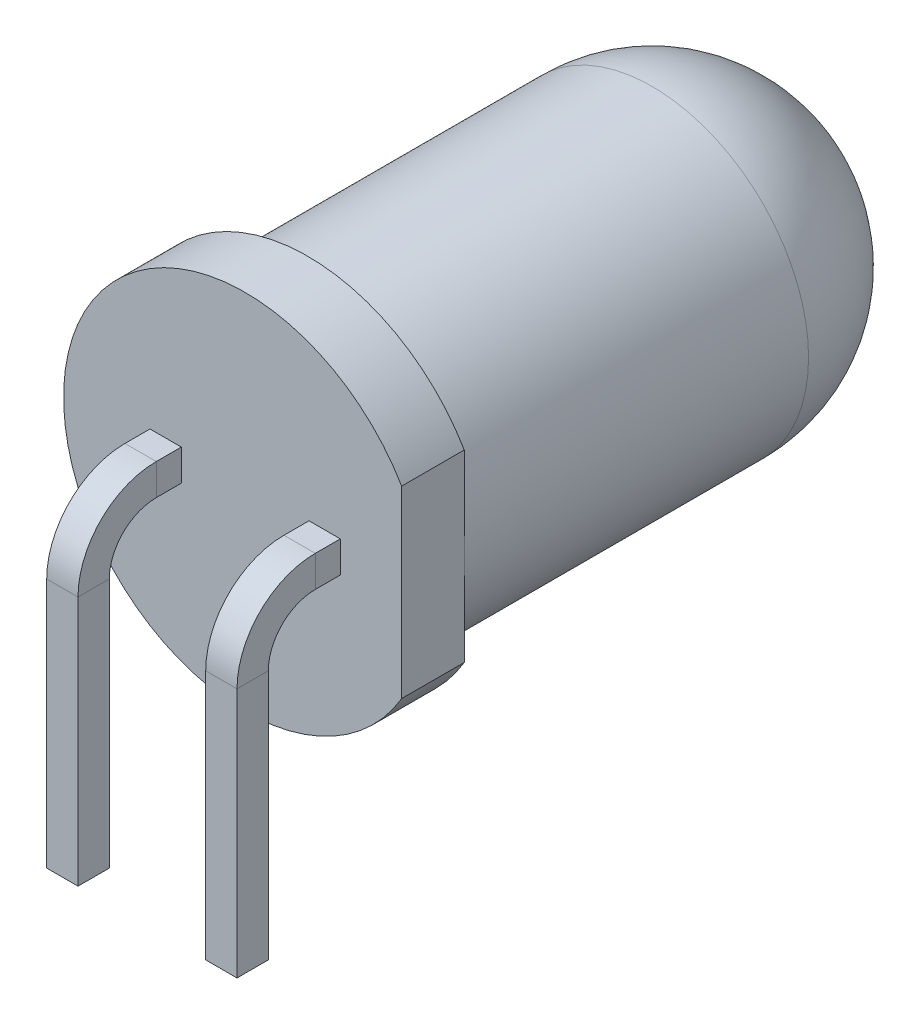
ISO-10303-21;
HEADER;
FILE_DESCRIPTION(('STEP AP214'),'2;1');
FILE_NAME('part.step','',(''),(''),'','','');
FILE_SCHEMA(('AUTOMOTIVE_DESIGN { 1 0 10303 214 1 1 1 1 }'));
ENDSEC;
DATA;
#1=APPLICATION_CONTEXT('core data for automotive mechanical design processes');
#2=APPLICATION_PROTOCOL_DEFINITION('international standard','automotive_design',2000,#1);
#3=PRODUCT_CONTEXT('',#1,'mechanical');
#4=PRODUCT('Part','Part','',(#3));
#5=PRODUCT_RELATED_PRODUCT_CATEGORY('part','',(#4));
#6=PRODUCT_DEFINITION_FORMATION('','',#4);
#7=PRODUCT_DEFINITION_CONTEXT('part definition',#1,'design');
#8=PRODUCT_DEFINITION('design','',#6,#7);
#9=PRODUCT_DEFINITION_SHAPE('','',#8);
#10=(LENGTH_UNIT() NAMED_UNIT(*) SI_UNIT(.MILLI.,.METRE.));
#11=(NAMED_UNIT(*) PLANE_ANGLE_UNIT() SI_UNIT($,.RADIAN.));
#12=(NAMED_UNIT(*) SI_UNIT($,.STERADIAN.) SOLID_ANGLE_UNIT());
#13=UNCERTAINTY_MEASURE_WITH_UNIT(LENGTH_MEASURE(1.E-05),#10,'distance_accuracy_value','');
#14=(GEOMETRIC_REPRESENTATION_CONTEXT(3) GLOBAL_UNCERTAINTY_ASSIGNED_CONTEXT((#13)) GLOBAL_UNIT_ASSIGNED_CONTEXT((#10,
#11,#12)) REPRESENTATION_CONTEXT('',''));
#15=CARTESIAN_POINT('',(0.,0.,0.));
#16=DIRECTION('',(0.,0.,1.));
#17=DIRECTION('',(1.,0.,0.));
#18=AXIS2_PLACEMENT_3D('',#15,#16,#17);
#19=CARTESIAN_POINT('',(2.9,0.,0.));
#20=DIRECTION('',(0.,0.,1.));
#21=DIRECTION('',(1.,0.,0.));
#22=AXIS2_PLACEMENT_3D('',#19,#20,#21);
#23=PLANE('',#22);
#24=DIRECTION('',(-1.,0.,0.));
#25=VECTOR('',#24,1.);
#26=CARTESIAN_POINT('',(-1.02,0.25,0.));
#27=LINE('',#26,#25);
#28=CARTESIAN_POINT('',(-1.02,0.25,0.));
#29=VERTEX_POINT('',#28);
#30=CARTESIAN_POINT('',(-1.52,0.25,0.));
#31=VERTEX_POINT('',#30);
#32=EDGE_CURVE('E49',#29,#31,#27,.T.);
#33=ORIENTED_EDGE('',*,*,#32,.F.);
#34=DIRECTION('',(0.,1.,0.));
#35=VECTOR('',#34,1.);
#36=CARTESIAN_POINT('',(-1.02,0.25,0.));
#37=LINE('',#36,#35);
#38=CARTESIAN_POINT('',(-1.02,-0.25,0.));
#39=VERTEX_POINT('',#38);
#40=EDGE_CURVE('E53',#39,#29,#37,.T.);
#41=ORIENTED_EDGE('',*,*,#40,.F.);
#42=DIRECTION('',(1.,0.,0.));
#43=VECTOR('',#42,1.);
#44=CARTESIAN_POINT('',(-1.02,-0.25,0.));
#45=LINE('',#44,#43);
#46=CARTESIAN_POINT('',(-1.52,-0.25,0.));
#47=VERTEX_POINT('',#46);
#48=EDGE_CURVE('E192',#47,#39,#45,.T.);
#49=ORIENTED_EDGE('',*,*,#48,.F.);
#50=DIRECTION('',(0.,-1.,0.));
#51=VECTOR('',#50,1.);
#52=CARTESIAN_POINT('',(-1.52,0.25,0.));
#53=LINE('',#52,#51);
#54=EDGE_CURVE('E210',#31,#47,#53,.T.);
#55=ORIENTED_EDGE('',*,*,#54,.F.);
#56=EDGE_LOOP('',(#33,#41,#49,#55));
#57=FACE_BOUND('',#56,.T.);
#58=DIRECTION('',(0.,1.,0.));
#59=VECTOR('',#58,1.);
#60=CARTESIAN_POINT('',(1.52,0.25,0.));
#61=LINE('',#60,#59);
#62=CARTESIAN_POINT('',(1.52,-0.25,0.));
#63=VERTEX_POINT('',#62);
#64=CARTESIAN_POINT('',(1.52,0.25,0.));
#65=VERTEX_POINT('',#64);
#66=EDGE_CURVE('E284',#63,#65,#61,.T.);
#67=ORIENTED_EDGE('',*,*,#66,.F.);
#68=DIRECTION('',(1.,0.,0.));
#69=VECTOR('',#68,1.);
#70=CARTESIAN_POINT('',(1.02,-0.25,0.));
#71=LINE('',#70,#69);
#72=CARTESIAN_POINT('',(1.02,-0.25,0.));
#73=VERTEX_POINT('',#72);
#74=EDGE_CURVE('E249',#73,#63,#71,.T.);
#75=ORIENTED_EDGE('',*,*,#74,.F.);
#76=DIRECTION('',(0.,-1.,0.));
#77=VECTOR('',#76,1.);
#78=CARTESIAN_POINT('',(1.02,0.25,0.));
#79=LINE('',#78,#77);
#80=CARTESIAN_POINT('',(1.02,0.25,0.));
#81=VERTEX_POINT('',#80);
#82=EDGE_CURVE('E246',#81,#73,#79,.T.);
#83=ORIENTED_EDGE('',*,*,#82,.F.);
#84=DIRECTION('',(-1.,0.,0.));
#85=VECTOR('',#84,1.);
#86=CARTESIAN_POINT('',(1.02,0.25,0.));
#87=LINE('',#86,#85);
#88=EDGE_CURVE('E260',#65,#81,#87,.T.);
#89=ORIENTED_EDGE('',*,*,#88,.F.);
#90=EDGE_LOOP('',(#67,#75,#83,#89));
#91=FACE_BOUND('',#90,.T.);
#92=DIRECTION('',(0.,-1.,0.));
#93=VECTOR('',#92,1.);
#94=CARTESIAN_POINT('',(2.5,1.46969384566991,0.));
#95=LINE('',#94,#93);
#96=CARTESIAN_POINT('',(2.5,1.46969384566991,0.));
#97=VERTEX_POINT('',#96);
#98=CARTESIAN_POINT('',(2.5,-1.46969384566991,0.));
#99=VERTEX_POINT('',#98);
#100=EDGE_CURVE('E326',#97,#99,#95,.T.);
#101=ORIENTED_EDGE('',*,*,#100,.F.);
#102=CARTESIAN_POINT('',(0.,0.,0.));
#103=DIRECTION('',(0.,0.,1.));
#104=DIRECTION('',(1.,0.,0.));
#105=AXIS2_PLACEMENT_3D('',#102,#103,#104);
#106=CIRCLE('',#105,2.9);
#107=EDGE_CURVE('E331',#97,#99,#106,.T.);
#108=ORIENTED_EDGE('',*,*,#107,.T.);
#109=EDGE_LOOP('',(#101,#108));
#110=FACE_BOUND('',#109,.T.);
#111=ADVANCED_FACE('F35',(#57,#91,#110),#23,.T.);
#112=CARTESIAN_POINT('',(0.,0.,-6.5));
#113=DIRECTION('',(0.,0.,1.));
#114=DIRECTION('',(1.,0.,0.));
#115=AXIS2_PLACEMENT_3D('',#112,#113,#114);
#116=SPHERICAL_SURFACE('',#115,2.5);
#117=CARTESIAN_POINT('',(0.,0.,-6.5));
#118=DIRECTION('',(0.,0.,1.));
#119=DIRECTION('',(1.,0.,0.));
#120=AXIS2_PLACEMENT_3D('',#117,#118,#119);
#121=CIRCLE('',#120,2.5);
#122=CARTESIAN_POINT('',(2.5,0.,-6.5));
#123=VERTEX_POINT('',#122);
#124=EDGE_CURVE('E340',#123,#123,#121,.T.);
#125=ORIENTED_EDGE('',*,*,#124,.F.);
#126=EDGE_LOOP('',(#125));
#127=FACE_BOUND('',#126,.T.);
#128=ADVANCED_FACE('F360',(#127),#116,.T.);
#129=CARTESIAN_POINT('',(0.,0.,0.));
#130=DIRECTION('',(0.,0.,1.));
#131=DIRECTION('',(1.,0.,0.));
#132=AXIS2_PLACEMENT_3D('',#129,#130,#131);
#133=CYLINDRICAL_SURFACE('',#132,2.5);
#134=ORIENTED_EDGE('',*,*,#124,.T.);
#135=EDGE_LOOP('',(#134));
#136=FACE_BOUND('',#135,.T.);
#137=CARTESIAN_POINT('',(0.,0.,-1.));
#138=DIRECTION('',(0.,0.,1.));
#139=DIRECTION('',(1.,0.,0.));
#140=AXIS2_PLACEMENT_3D('',#137,#138,#139);
#141=CIRCLE('',#140,2.5);
#142=CARTESIAN_POINT('',(2.5,0.,-1.));
#143=VERTEX_POINT('',#142);
#144=EDGE_CURVE('E337',#143,#143,#141,.T.);
#145=ORIENTED_EDGE('',*,*,#144,.F.);
#146=EDGE_LOOP('',(#145));
#147=FACE_BOUND('',#146,.T.);
#148=ADVANCED_FACE('F358',(#136,#147),#133,.T.);
#149=CARTESIAN_POINT('',(2.5,0.,-1.));
#150=DIRECTION('',(0.,0.,-1.));
#151=DIRECTION('',(-1.,0.,0.));
#152=AXIS2_PLACEMENT_3D('',#149,#150,#151);
#153=PLANE('',#152);
#154=DIRECTION('',(0.,1.,0.));
#155=VECTOR('',#154,1.);
#156=CARTESIAN_POINT('',(2.5,0.,-1.));
#157=LINE('',#156,#155);
#158=CARTESIAN_POINT('',(2.5,-1.46969384566991,-0.999999999999999));
#159=VERTEX_POINT('',#158);
#160=EDGE_CURVE('E330',#159,#143,#157,.T.);
#161=ORIENTED_EDGE('',*,*,#160,.F.);
#162=CARTESIAN_POINT('',(0.,0.,-1.));
#163=DIRECTION('',(0.,0.,1.));
#164=DIRECTION('',(1.,0.,0.));
#165=AXIS2_PLACEMENT_3D('',#162,#163,#164);
#166=CIRCLE('',#165,2.9);
#167=CARTESIAN_POINT('',(2.5,1.46969384566991,-1.));
#168=VERTEX_POINT('',#167);
#169=EDGE_CURVE('E334',#168,#159,#166,.T.);
#170=ORIENTED_EDGE('',*,*,#169,.F.);
#171=EDGE_CURVE('E328',#143,#168,#157,.T.);
#172=ORIENTED_EDGE('',*,*,#171,.F.);
#173=ORIENTED_EDGE('',*,*,#144,.T.);
#174=EDGE_LOOP('',(#161,#170,#172,#173));
#175=FACE_BOUND('',#174,.T.);
#176=ADVANCED_FACE('F355',(#175),#153,.T.);
#177=CARTESIAN_POINT('',(0.,0.,0.));
#178=DIRECTION('',(0.,0.,1.));
#179=DIRECTION('',(1.,0.,0.));
#180=AXIS2_PLACEMENT_3D('',#177,#178,#179);
#181=CYLINDRICAL_SURFACE('',#180,2.9);
#182=DIRECTION('',(0.,0.,1.));
#183=VECTOR('',#182,1.);
#184=CARTESIAN_POINT('',(2.5,-1.46969384566991,0.));
#185=LINE('',#184,#183);
#186=EDGE_CURVE('E11',#99,#159,#185,.F.);
#187=ORIENTED_EDGE('',*,*,#186,.F.);
#188=ORIENTED_EDGE('',*,*,#107,.F.);
#189=DIRECTION('',(0.,0.,1.));
#190=VECTOR('',#189,1.);
#191=CARTESIAN_POINT('',(2.5,1.46969384566991,0.));
#192=LINE('',#191,#190);
#193=EDGE_CURVE('E42',#168,#97,#192,.T.);
#194=ORIENTED_EDGE('',*,*,#193,.F.);
#195=ORIENTED_EDGE('',*,*,#169,.T.);
#196=EDGE_LOOP('',(#187,#188,#194,#195));
#197=FACE_BOUND('',#196,.T.);
#198=ADVANCED_FACE('F352',(#197),#181,.T.);
#199=CARTESIAN_POINT('',(2.5,1.46969384566991,-9.));
#200=DIRECTION('',(-1.,0.,0.));
#201=DIRECTION('',(0.,0.,1.));
#202=AXIS2_PLACEMENT_3D('',#199,#200,#201);
#203=PLANE('',#202);
#204=ORIENTED_EDGE('',*,*,#160,.T.);
#205=ORIENTED_EDGE('',*,*,#171,.T.);
#206=ORIENTED_EDGE('',*,*,#193,.T.);
#207=ORIENTED_EDGE('',*,*,#100,.T.);
#208=ORIENTED_EDGE('',*,*,#186,.T.);
#209=EDGE_LOOP('',(#204,#205,#206,#207,#208));
#210=FACE_BOUND('',#209,.T.);
#211=ADVANCED_FACE('F345',(#210),#203,.F.);
#212=CARTESIAN_POINT('',(0.,-5.,1.4));
#213=DIRECTION('',(0.,-1.,0.));
#214=DIRECTION('',(1.,0.,0.));
#215=AXIS2_PLACEMENT_3D('',#212,#213,#214);
#216=PLANE('',#215);
#217=DIRECTION('',(0.,0.,1.));
#218=VECTOR('',#217,1.);
#219=CARTESIAN_POINT('',(1.52,-5.,1.65));
#220=LINE('',#219,#218);
#221=CARTESIAN_POINT('',(1.52,-5.,1.15));
#222=VERTEX_POINT('',#221);
#223=CARTESIAN_POINT('',(1.52,-5.,1.65));
#224=VERTEX_POINT('',#223);
#225=EDGE_CURVE('E301',#222,#224,#220,.T.);
#226=ORIENTED_EDGE('',*,*,#225,.T.);
#227=DIRECTION('',(-1.,0.,0.));
#228=VECTOR('',#227,1.);
#229=CARTESIAN_POINT('',(1.02,-5.,1.65));
#230=LINE('',#229,#228);
#231=CARTESIAN_POINT('',(1.02,-5.,1.65));
#232=VERTEX_POINT('',#231);
#233=EDGE_CURVE('E318',#224,#232,#230,.T.);
#234=ORIENTED_EDGE('',*,*,#233,.T.);
#235=DIRECTION('',(0.,0.,-1.));
#236=VECTOR('',#235,1.);
#237=CARTESIAN_POINT('',(1.02,-5.,1.65));
#238=LINE('',#237,#236);
#239=CARTESIAN_POINT('',(1.02,-5.,1.15));
#240=VERTEX_POINT('',#239);
#241=EDGE_CURVE('E272',#232,#240,#238,.T.);
#242=ORIENTED_EDGE('',*,*,#241,.T.);
#243=DIRECTION('',(1.,0.,0.));
#244=VECTOR('',#243,1.);
#245=CARTESIAN_POINT('',(1.02,-5.,1.15));
#246=LINE('',#245,#244);
#247=EDGE_CURVE('E278',#240,#222,#246,.T.);
#248=ORIENTED_EDGE('',*,*,#247,.T.);
#249=EDGE_LOOP('',(#226,#234,#242,#248));
#250=FACE_BOUND('',#249,.T.);
#251=ADVANCED_FACE('F426',(#250),#216,.T.);
#252=CARTESIAN_POINT('',(1.02,0.25,0.));
#253=DIRECTION('',(-1.,0.,0.));
#254=DIRECTION('',(0.,0.,1.));
#255=AXIS2_PLACEMENT_3D('',#252,#253,#254);
#256=PLANE('',#255);
#257=DIRECTION('',(0.,0.,1.));
#258=VECTOR('',#257,1.);
#259=CARTESIAN_POINT('',(1.02,-0.25,0.));
#260=LINE('',#259,#258);
#261=CARTESIAN_POINT('',(1.02,-0.25,0.4));
#262=VERTEX_POINT('',#261);
#263=EDGE_CURVE('E253',#73,#262,#260,.T.);
#264=ORIENTED_EDGE('',*,*,#263,.T.);
#265=DIRECTION('',(0.,-1.,0.));
#266=VECTOR('',#265,1.);
#267=CARTESIAN_POINT('',(1.02,0.25,0.4));
#268=LINE('',#267,#266);
#269=CARTESIAN_POINT('',(1.02,0.25,0.4));
#270=VERTEX_POINT('',#269);
#271=EDGE_CURVE('E250',#270,#262,#268,.T.);
#272=ORIENTED_EDGE('',*,*,#271,.F.);
#273=DIRECTION('',(0.,0.,1.));
#274=VECTOR('',#273,1.);
#275=CARTESIAN_POINT('',(1.02,0.25,0.));
#276=LINE('',#275,#274);
#277=EDGE_CURVE('E254',#81,#270,#276,.T.);
#278=ORIENTED_EDGE('',*,*,#277,.F.);
#279=ORIENTED_EDGE('',*,*,#82,.T.);
#280=EDGE_LOOP('',(#264,#272,#278,#279));
#281=FACE_BOUND('',#280,.T.);
#282=ADVANCED_FACE('F405',(#281),#256,.T.);
#283=CARTESIAN_POINT('',(1.02,-0.25,0.));
#284=DIRECTION('',(0.,-1.,0.));
#285=DIRECTION('',(0.,0.,-1.));
#286=AXIS2_PLACEMENT_3D('',#283,#284,#285);
#287=PLANE('',#286);
#288=DIRECTION('',(0.,0.,1.));
#289=VECTOR('',#288,1.);
#290=CARTESIAN_POINT('',(1.52,-0.25,0.));
#291=LINE('',#290,#289);
#292=CARTESIAN_POINT('',(1.52,-0.25,0.4));
#293=VERTEX_POINT('',#292);
#294=EDGE_CURVE('E287',#63,#293,#291,.T.);
#295=ORIENTED_EDGE('',*,*,#294,.T.);
#296=DIRECTION('',(1.,0.,0.));
#297=VECTOR('',#296,1.);
#298=CARTESIAN_POINT('',(1.02,-0.25,0.4));
#299=LINE('',#298,#297);
#300=EDGE_CURVE('E257',#262,#293,#299,.T.);
#301=ORIENTED_EDGE('',*,*,#300,.F.);
#302=ORIENTED_EDGE('',*,*,#263,.F.);
#303=ORIENTED_EDGE('',*,*,#74,.T.);
#304=EDGE_LOOP('',(#295,#301,#302,#303));
#305=FACE_BOUND('',#304,.T.);
#306=ADVANCED_FACE('F378',(#305),#287,.T.);
#307=CARTESIAN_POINT('',(1.52,0.25,0.));
#308=DIRECTION('',(1.,0.,0.));
#309=DIRECTION('',(0.,0.,-1.));
#310=AXIS2_PLACEMENT_3D('',#307,#308,#309);
#311=PLANE('',#310);
#312=DIRECTION('',(0.,0.,1.));
#313=VECTOR('',#312,1.);
#314=CARTESIAN_POINT('',(1.52,0.25,0.));
#315=LINE('',#314,#313);
#316=CARTESIAN_POINT('',(1.52,0.25,0.4));
#317=VERTEX_POINT('',#316);
#318=EDGE_CURVE('E306',#65,#317,#315,.T.);
#319=ORIENTED_EDGE('',*,*,#318,.T.);
#320=DIRECTION('',(0.,1.,0.));
#321=VECTOR('',#320,1.);
#322=CARTESIAN_POINT('',(1.52,0.25,0.4));
#323=LINE('',#322,#321);
#324=EDGE_CURVE('E290',#293,#317,#323,.T.);
#325=ORIENTED_EDGE('',*,*,#324,.F.);
#326=ORIENTED_EDGE('',*,*,#294,.F.);
#327=ORIENTED_EDGE('',*,*,#66,.T.);
#328=EDGE_LOOP('',(#319,#325,#326,#327));
#329=FACE_BOUND('',#328,.T.);
#330=ADVANCED_FACE('F381',(#329),#311,.T.);
#331=CARTESIAN_POINT('',(1.02,0.25,0.));
#332=DIRECTION('',(0.,1.,0.));
#333=DIRECTION('',(0.,0.,1.));
#334=AXIS2_PLACEMENT_3D('',#331,#332,#333);
#335=PLANE('',#334);
#336=DIRECTION('',(-1.,0.,0.));
#337=VECTOR('',#336,1.);
#338=CARTESIAN_POINT('',(1.02,0.25,0.4));
#339=LINE('',#338,#337);
#340=EDGE_CURVE('E271',#317,#270,#339,.T.);
#341=ORIENTED_EDGE('',*,*,#340,.F.);
#342=ORIENTED_EDGE('',*,*,#318,.F.);
#343=ORIENTED_EDGE('',*,*,#88,.T.);
#344=ORIENTED_EDGE('',*,*,#277,.T.);
#345=EDGE_LOOP('',(#341,#342,#343,#344));
#346=FACE_BOUND('',#345,.T.);
#347=ADVANCED_FACE('F406',(#346),#335,.T.);
#348=CARTESIAN_POINT('',(1.02,0.25,0.4));
#349=DIRECTION('',(-1.,0.,0.));
#350=DIRECTION('',(0.,0.,1.));
#351=AXIS2_PLACEMENT_3D('',#348,#349,#350);
#352=PLANE('',#351);
#353=CARTESIAN_POINT('',(1.02,-1.,0.4));
#354=DIRECTION('',(1.,0.,0.));
#355=DIRECTION('',(0.,1.,0.));
#356=AXIS2_PLACEMENT_3D('',#353,#354,#355);
#357=CIRCLE('',#356,0.75);
#358=CARTESIAN_POINT('',(1.02,-1.,1.15));
#359=VERTEX_POINT('',#358);
#360=EDGE_CURVE('E264',#262,#359,#357,.T.);
#361=ORIENTED_EDGE('',*,*,#360,.T.);
#362=DIRECTION('',(0.,0.,-1.));
#363=VECTOR('',#362,1.);
#364=CARTESIAN_POINT('',(1.02,-1.,1.65));
#365=LINE('',#364,#363);
#366=CARTESIAN_POINT('',(1.02,-1.,1.65));
#367=VERTEX_POINT('',#366);
#368=EDGE_CURVE('E261',#367,#359,#365,.T.);
#369=ORIENTED_EDGE('',*,*,#368,.F.);
#370=CARTESIAN_POINT('',(1.02,-1.,0.4));
#371=DIRECTION('',(1.,0.,0.));
#372=DIRECTION('',(0.,1.,0.));
#373=AXIS2_PLACEMENT_3D('',#370,#371,#372);
#374=CIRCLE('',#373,1.25);
#375=EDGE_CURVE('E265',#270,#367,#374,.T.);
#376=ORIENTED_EDGE('',*,*,#375,.F.);
#377=ORIENTED_EDGE('',*,*,#271,.T.);
#378=EDGE_LOOP('',(#361,#369,#376,#377));
#379=FACE_BOUND('',#378,.T.);
#380=ADVANCED_FACE('F396',(#379),#352,.T.);
#381=CARTESIAN_POINT('',(1.27,-1.,0.4));
#382=DIRECTION('',(1.,0.,0.));
#383=DIRECTION('',(0.,0.,-1.));
#384=AXIS2_PLACEMENT_3D('',#381,#382,#383);
#385=CYLINDRICAL_SURFACE('',#384,0.75);
#386=CARTESIAN_POINT('',(1.52,-1.,0.4));
#387=DIRECTION('',(1.,0.,0.));
#388=DIRECTION('',(0.,1.,0.));
#389=AXIS2_PLACEMENT_3D('',#386,#387,#388);
#390=CIRCLE('',#389,0.75);
#391=CARTESIAN_POINT('',(1.52,-1.,1.15));
#392=VERTEX_POINT('',#391);
#393=EDGE_CURVE('E293',#293,#392,#390,.T.);
#394=ORIENTED_EDGE('',*,*,#393,.T.);
#395=DIRECTION('',(1.,0.,0.));
#396=VECTOR('',#395,1.);
#397=CARTESIAN_POINT('',(1.02,-1.,1.15));
#398=LINE('',#397,#396);
#399=EDGE_CURVE('E268',#359,#392,#398,.T.);
#400=ORIENTED_EDGE('',*,*,#399,.F.);
#401=ORIENTED_EDGE('',*,*,#360,.F.);
#402=ORIENTED_EDGE('',*,*,#300,.T.);
#403=EDGE_LOOP('',(#394,#400,#401,#402));
#404=FACE_BOUND('',#403,.T.);
#405=ADVANCED_FACE('F387',(#404),#385,.F.);
#406=CARTESIAN_POINT('',(1.52,0.25,0.4));
#407=DIRECTION('',(1.,0.,0.));
#408=DIRECTION('',(0.,0.,-1.));
#409=AXIS2_PLACEMENT_3D('',#406,#407,#408);
#410=PLANE('',#409);
#411=CARTESIAN_POINT('',(1.52,-1.,0.4));
#412=DIRECTION('',(1.,0.,0.));
#413=DIRECTION('',(0.,1.,0.));
#414=AXIS2_PLACEMENT_3D('',#411,#412,#413);
#415=CIRCLE('',#414,1.25);
#416=CARTESIAN_POINT('',(1.52,-1.,1.65));
#417=VERTEX_POINT('',#416);
#418=EDGE_CURVE('E311',#317,#417,#415,.T.);
#419=ORIENTED_EDGE('',*,*,#418,.T.);
#420=DIRECTION('',(0.,0.,1.));
#421=VECTOR('',#420,1.);
#422=CARTESIAN_POINT('',(1.52,-1.,1.65));
#423=LINE('',#422,#421);
#424=EDGE_CURVE('E296',#392,#417,#423,.T.);
#425=ORIENTED_EDGE('',*,*,#424,.F.);
#426=ORIENTED_EDGE('',*,*,#393,.F.);
#427=ORIENTED_EDGE('',*,*,#324,.T.);
#428=EDGE_LOOP('',(#419,#425,#426,#427));
#429=FACE_BOUND('',#428,.T.);
#430=ADVANCED_FACE('F383',(#429),#410,.T.);
#431=CARTESIAN_POINT('',(1.27,-1.,0.4));
#432=DIRECTION('',(1.,0.,0.));
#433=DIRECTION('',(0.,0.,-1.));
#434=AXIS2_PLACEMENT_3D('',#431,#432,#433);
#435=CYLINDRICAL_SURFACE('',#434,1.25);
#436=DIRECTION('',(-1.,0.,0.));
#437=VECTOR('',#436,1.);
#438=CARTESIAN_POINT('',(1.02,-1.,1.65));
#439=LINE('',#438,#437);
#440=EDGE_CURVE('E281',#417,#367,#439,.T.);
#441=ORIENTED_EDGE('',*,*,#440,.F.);
#442=ORIENTED_EDGE('',*,*,#418,.F.);
#443=ORIENTED_EDGE('',*,*,#340,.T.);
#444=ORIENTED_EDGE('',*,*,#375,.T.);
#445=EDGE_LOOP('',(#441,#442,#443,#444));
#446=FACE_BOUND('',#445,.T.);
#447=ADVANCED_FACE('F399',(#446),#435,.T.);
#448=CARTESIAN_POINT('',(1.02,-1.,1.65));
#449=DIRECTION('',(-1.,0.,0.));
#450=DIRECTION('',(0.,0.,1.));
#451=AXIS2_PLACEMENT_3D('',#448,#449,#450);
#452=PLANE('',#451);
#453=DIRECTION('',(0.,-1.,0.));
#454=VECTOR('',#453,1.);
#455=CARTESIAN_POINT('',(1.02,-1.,1.15));
#456=LINE('',#455,#454);
#457=EDGE_CURVE('E274',#359,#240,#456,.T.);
#458=ORIENTED_EDGE('',*,*,#457,.T.);
#459=ORIENTED_EDGE('',*,*,#241,.F.);
#460=DIRECTION('',(0.,-1.,0.));
#461=VECTOR('',#460,1.);
#462=CARTESIAN_POINT('',(1.02,-1.,1.65));
#463=LINE('',#462,#461);
#464=EDGE_CURVE('E275',#367,#232,#463,.T.);
#465=ORIENTED_EDGE('',*,*,#464,.F.);
#466=ORIENTED_EDGE('',*,*,#368,.T.);
#467=EDGE_LOOP('',(#458,#459,#465,#466));
#468=FACE_BOUND('',#467,.T.);
#469=ADVANCED_FACE('F393',(#468),#452,.T.);
#470=CARTESIAN_POINT('',(1.02,-1.,1.15));
#471=DIRECTION('',(0.,0.,-1.));
#472=DIRECTION('',(0.,1.,0.));
#473=AXIS2_PLACEMENT_3D('',#470,#471,#472);
#474=PLANE('',#473);
#475=DIRECTION('',(0.,-1.,0.));
#476=VECTOR('',#475,1.);
#477=CARTESIAN_POINT('',(1.52,-1.,1.15));
#478=LINE('',#477,#476);
#479=EDGE_CURVE('E298',#392,#222,#478,.T.);
#480=ORIENTED_EDGE('',*,*,#479,.T.);
#481=ORIENTED_EDGE('',*,*,#247,.F.);
#482=ORIENTED_EDGE('',*,*,#457,.F.);
#483=ORIENTED_EDGE('',*,*,#399,.T.);
#484=EDGE_LOOP('',(#480,#481,#482,#483));
#485=FACE_BOUND('',#484,.T.);
#486=ADVANCED_FACE('F389',(#485),#474,.T.);
#487=CARTESIAN_POINT('',(1.52,-1.,1.65));
#488=DIRECTION('',(1.,0.,0.));
#489=DIRECTION('',(0.,0.,-1.));
#490=AXIS2_PLACEMENT_3D('',#487,#488,#489);
#491=PLANE('',#490);
#492=DIRECTION('',(0.,-1.,0.));
#493=VECTOR('',#492,1.);
#494=CARTESIAN_POINT('',(1.52,-1.,1.65));
#495=LINE('',#494,#493);
#496=EDGE_CURVE('E315',#417,#224,#495,.T.);
#497=ORIENTED_EDGE('',*,*,#496,.T.);
#498=ORIENTED_EDGE('',*,*,#225,.F.);
#499=ORIENTED_EDGE('',*,*,#479,.F.);
#500=ORIENTED_EDGE('',*,*,#424,.T.);
#501=EDGE_LOOP('',(#497,#498,#499,#500));
#502=FACE_BOUND('',#501,.T.);
#503=ADVANCED_FACE('F417',(#502),#491,.T.);
#504=CARTESIAN_POINT('',(1.02,-1.,1.65));
#505=DIRECTION('',(0.,0.,1.));
#506=DIRECTION('',(0.,-1.,0.));
#507=AXIS2_PLACEMENT_3D('',#504,#505,#506);
#508=PLANE('',#507);
#509=ORIENTED_EDGE('',*,*,#233,.F.);
#510=ORIENTED_EDGE('',*,*,#496,.F.);
#511=ORIENTED_EDGE('',*,*,#440,.T.);
#512=ORIENTED_EDGE('',*,*,#464,.T.);
#513=EDGE_LOOP('',(#509,#510,#511,#512));
#514=FACE_BOUND('',#513,.T.);
#515=ADVANCED_FACE('F421',(#514),#508,.T.);
#516=CARTESIAN_POINT('',(0.,-5.,1.4));
#517=DIRECTION('',(0.,-1.,0.));
#518=DIRECTION('',(1.,0.,0.));
#519=AXIS2_PLACEMENT_3D('',#516,#517,#518);
#520=PLANE('',#519);
#521=DIRECTION('',(-1.,0.,0.));
#522=VECTOR('',#521,1.);
#523=CARTESIAN_POINT('',(-1.02,-5.,1.65));
#524=LINE('',#523,#522);
#525=CARTESIAN_POINT('',(-1.02,-5.,1.65));
#526=VERTEX_POINT('',#525);
#527=CARTESIAN_POINT('',(-1.52,-5.,1.65));
#528=VERTEX_POINT('',#527);
#529=EDGE_CURVE('E200',#526,#528,#524,.T.);
#530=ORIENTED_EDGE('',*,*,#529,.T.);
#531=DIRECTION('',(0.,0.,-1.));
#532=VECTOR('',#531,1.);
#533=CARTESIAN_POINT('',(-1.52,-5.,1.65));
#534=LINE('',#533,#532);
#535=CARTESIAN_POINT('',(-1.52,-5.,1.15));
#536=VERTEX_POINT('',#535);
#537=EDGE_CURVE('E206',#528,#536,#534,.T.);
#538=ORIENTED_EDGE('',*,*,#537,.T.);
#539=DIRECTION('',(1.,0.,0.));
#540=VECTOR('',#539,1.);
#541=CARTESIAN_POINT('',(-1.02,-5.,1.15));
#542=LINE('',#541,#540);
#543=CARTESIAN_POINT('',(-1.02,-5.,1.15));
#544=VERTEX_POINT('',#543);
#545=EDGE_CURVE('E230',#536,#544,#542,.T.);
#546=ORIENTED_EDGE('',*,*,#545,.T.);
#547=DIRECTION('',(0.,0.,1.));
#548=VECTOR('',#547,1.);
#549=CARTESIAN_POINT('',(-1.02,-5.,1.65));
#550=LINE('',#549,#548);
#551=EDGE_CURVE('E241',#544,#526,#550,.T.);
#552=ORIENTED_EDGE('',*,*,#551,.T.);
#553=EDGE_LOOP('',(#530,#538,#546,#552));
#554=FACE_BOUND('',#553,.T.);
#555=ADVANCED_FACE('F424',(#554),#520,.T.);
#556=CARTESIAN_POINT('',(-1.02,0.25,0.));
#557=DIRECTION('',(0.,1.,0.));
#558=DIRECTION('',(-1.,0.,0.));
#559=AXIS2_PLACEMENT_3D('',#556,#557,#558);
#560=PLANE('',#559);
#561=DIRECTION('',(0.,0.,1.));
#562=VECTOR('',#561,1.);
#563=CARTESIAN_POINT('',(-1.52,0.25,0.));
#564=LINE('',#563,#562);
#565=CARTESIAN_POINT('',(-1.52,0.25,0.4));
#566=VERTEX_POINT('',#565);
#567=EDGE_CURVE('E188',#31,#566,#564,.T.);
#568=ORIENTED_EDGE('',*,*,#567,.T.);
#569=DIRECTION('',(-1.,0.,0.));
#570=VECTOR('',#569,1.);
#571=CARTESIAN_POINT('',(-1.02,0.25,0.4));
#572=LINE('',#571,#570);
#573=CARTESIAN_POINT('',(-1.02,0.25,0.4));
#574=VERTEX_POINT('',#573);
#575=EDGE_CURVE('E165',#574,#566,#572,.T.);
#576=ORIENTED_EDGE('',*,*,#575,.F.);
#577=DIRECTION('',(0.,0.,1.));
#578=VECTOR('',#577,1.);
#579=CARTESIAN_POINT('',(-1.02,0.25,0.));
#580=LINE('',#579,#578);
#581=EDGE_CURVE('E186',#29,#574,#580,.T.);
#582=ORIENTED_EDGE('',*,*,#581,.F.);
#583=ORIENTED_EDGE('',*,*,#32,.T.);
#584=EDGE_LOOP('',(#568,#576,#582,#583));
#585=FACE_BOUND('',#584,.T.);
#586=ADVANCED_FACE('F185',(#585),#560,.T.);
#587=CARTESIAN_POINT('',(-1.52,0.25,0.));
#588=DIRECTION('',(-1.,0.,0.));
#589=DIRECTION('',(0.,0.,1.));
#590=AXIS2_PLACEMENT_3D('',#587,#588,#589);
#591=PLANE('',#590);
#592=DIRECTION('',(0.,0.,1.));
#593=VECTOR('',#592,1.);
#594=CARTESIAN_POINT('',(-1.52,-0.25,0.));
#595=LINE('',#594,#593);
#596=CARTESIAN_POINT('',(-1.52,-0.25,0.4));
#597=VERTEX_POINT('',#596);
#598=EDGE_CURVE('E216',#47,#597,#595,.T.);
#599=ORIENTED_EDGE('',*,*,#598,.T.);
#600=DIRECTION('',(0.,-1.,0.));
#601=VECTOR('',#600,1.);
#602=CARTESIAN_POINT('',(-1.52,0.25,0.4));
#603=LINE('',#602,#601);
#604=EDGE_CURVE('E213',#566,#597,#603,.T.);
#605=ORIENTED_EDGE('',*,*,#604,.F.);
#606=ORIENTED_EDGE('',*,*,#567,.F.);
#607=ORIENTED_EDGE('',*,*,#54,.T.);
#608=EDGE_LOOP('',(#599,#605,#606,#607));
#609=FACE_BOUND('',#608,.T.);
#610=ADVANCED_FACE('F541',(#609),#591,.T.);
#611=CARTESIAN_POINT('',(-1.02,-0.25,0.));
#612=DIRECTION('',(0.,-1.,0.));
#613=DIRECTION('',(1.,0.,0.));
#614=AXIS2_PLACEMENT_3D('',#611,#612,#613);
#615=PLANE('',#614);
#616=DIRECTION('',(0.,0.,1.));
#617=VECTOR('',#616,1.);
#618=CARTESIAN_POINT('',(-1.02,-0.25,0.));
#619=LINE('',#618,#617);
#620=CARTESIAN_POINT('',(-1.02,-0.25,0.4));
#621=VERTEX_POINT('',#620);
#622=EDGE_CURVE('E180',#39,#621,#619,.T.);
#623=ORIENTED_EDGE('',*,*,#622,.T.);
#624=DIRECTION('',(1.,0.,0.));
#625=VECTOR('',#624,1.);
#626=CARTESIAN_POINT('',(-1.02,-0.25,0.4));
#627=LINE('',#626,#625);
#628=EDGE_CURVE('E219',#597,#621,#627,.T.);
#629=ORIENTED_EDGE('',*,*,#628,.F.);
#630=ORIENTED_EDGE('',*,*,#598,.F.);
#631=ORIENTED_EDGE('',*,*,#48,.T.);
#632=EDGE_LOOP('',(#623,#629,#630,#631));
#633=FACE_BOUND('',#632,.T.);
#634=ADVANCED_FACE('F550',(#633),#615,.T.);
#635=CARTESIAN_POINT('',(-1.02,0.25,0.));
#636=DIRECTION('',(1.,0.,0.));
#637=DIRECTION('',(0.,0.,-1.));
#638=AXIS2_PLACEMENT_3D('',#635,#636,#637);
#639=PLANE('',#638);
#640=DIRECTION('',(0.,1.,0.));
#641=VECTOR('',#640,1.);
#642=CARTESIAN_POINT('',(-1.02,0.25,0.4));
#643=LINE('',#642,#641);
#644=EDGE_CURVE('E170',#621,#574,#643,.T.);
#645=ORIENTED_EDGE('',*,*,#644,.F.);
#646=ORIENTED_EDGE('',*,*,#622,.F.);
#647=ORIENTED_EDGE('',*,*,#40,.T.);
#648=ORIENTED_EDGE('',*,*,#581,.T.);
#649=EDGE_LOOP('',(#645,#646,#647,#648));
#650=FACE_BOUND('',#649,.T.);
#651=ADVANCED_FACE('F190',(#650),#639,.T.);
#652=CARTESIAN_POINT('',(1.27,-1.,0.4));
#653=DIRECTION('',(1.,0.,0.));
#654=DIRECTION('',(0.,0.,-1.));
#655=AXIS2_PLACEMENT_3D('',#652,#653,#654);
#656=CYLINDRICAL_SURFACE('',#655,1.25);
#657=CARTESIAN_POINT('',(-1.52,-1.,0.4));
#658=DIRECTION('',(1.,0.,0.));
#659=DIRECTION('',(0.,1.,0.));
#660=AXIS2_PLACEMENT_3D('',#657,#658,#659);
#661=CIRCLE('',#660,1.25);
#662=CARTESIAN_POINT('',(-1.52,-1.,1.65));
#663=VERTEX_POINT('',#662);
#664=EDGE_CURVE('E197',#566,#663,#661,.T.);
#665=ORIENTED_EDGE('',*,*,#664,.T.);
#666=DIRECTION('',(-1.,0.,0.));
#667=VECTOR('',#666,1.);
#668=CARTESIAN_POINT('',(-1.02,-1.,1.65));
#669=LINE('',#668,#667);
#670=CARTESIAN_POINT('',(-1.02,-1.,1.65));
#671=VERTEX_POINT('',#670);
#672=EDGE_CURVE('E167',#671,#663,#669,.T.);
#673=ORIENTED_EDGE('',*,*,#672,.F.);
#674=CARTESIAN_POINT('',(-1.02,-1.,0.4));
#675=DIRECTION('',(1.,0.,0.));
#676=DIRECTION('',(0.,1.,0.));
#677=AXIS2_PLACEMENT_3D('',#674,#675,#676);
#678=CIRCLE('',#677,1.25);
#679=EDGE_CURVE('E160',#574,#671,#678,.T.);
#680=ORIENTED_EDGE('',*,*,#679,.F.);
#681=ORIENTED_EDGE('',*,*,#575,.T.);
#682=EDGE_LOOP('',(#665,#673,#680,#681));
#683=FACE_BOUND('',#682,.T.);
#684=ADVANCED_FACE('F163',(#683),#656,.T.);
#685=CARTESIAN_POINT('',(-1.52,0.25,0.4));
#686=DIRECTION('',(-1.,0.,0.));
#687=DIRECTION('',(0.,0.,1.));
#688=AXIS2_PLACEMENT_3D('',#685,#686,#687);
#689=PLANE('',#688);
#690=CARTESIAN_POINT('',(-1.52,-1.,0.4));
#691=DIRECTION('',(1.,0.,0.));
#692=DIRECTION('',(0.,1.,0.));
#693=AXIS2_PLACEMENT_3D('',#690,#691,#692);
#694=CIRCLE('',#693,0.75);
#695=CARTESIAN_POINT('',(-1.52,-1.,1.15));
#696=VERTEX_POINT('',#695);
#697=EDGE_CURVE('E222',#597,#696,#694,.T.);
#698=ORIENTED_EDGE('',*,*,#697,.T.);
#699=DIRECTION('',(0.,0.,-1.));
#700=VECTOR('',#699,1.);
#701=CARTESIAN_POINT('',(-1.52,-1.,1.65));
#702=LINE('',#701,#700);
#703=EDGE_CURVE('E198',#663,#696,#702,.T.);
#704=ORIENTED_EDGE('',*,*,#703,.F.);
#705=ORIENTED_EDGE('',*,*,#664,.F.);
#706=ORIENTED_EDGE('',*,*,#604,.T.);
#707=EDGE_LOOP('',(#698,#704,#705,#706));
#708=FACE_BOUND('',#707,.T.);
#709=ADVANCED_FACE('F577',(#708),#689,.T.);
#710=CARTESIAN_POINT('',(1.27,-1.,0.4));
#711=DIRECTION('',(1.,0.,0.));
#712=DIRECTION('',(0.,0.,-1.));
#713=AXIS2_PLACEMENT_3D('',#710,#711,#712);
#714=CYLINDRICAL_SURFACE('',#713,0.75);
#715=CARTESIAN_POINT('',(-1.02,-1.,0.4));
#716=DIRECTION('',(1.,0.,0.));
#717=DIRECTION('',(0.,1.,0.));
#718=AXIS2_PLACEMENT_3D('',#715,#716,#717);
#719=CIRCLE('',#718,0.75);
#720=CARTESIAN_POINT('',(-1.02,-1.,1.15));
#721=VERTEX_POINT('',#720);
#722=EDGE_CURVE('E175',#621,#721,#719,.T.);
#723=ORIENTED_EDGE('',*,*,#722,.T.);
#724=DIRECTION('',(1.,0.,0.));
#725=VECTOR('',#724,1.);
#726=CARTESIAN_POINT('',(-1.02,-1.,1.15));
#727=LINE('',#726,#725);
#728=EDGE_CURVE('E225',#696,#721,#727,.T.);
#729=ORIENTED_EDGE('',*,*,#728,.F.);
#730=ORIENTED_EDGE('',*,*,#697,.F.);
#731=ORIENTED_EDGE('',*,*,#628,.T.);
#732=EDGE_LOOP('',(#723,#729,#730,#731));
#733=FACE_BOUND('',#732,.T.);
#734=ADVANCED_FACE('F586',(#733),#714,.F.);
#735=CARTESIAN_POINT('',(-1.02,0.25,0.4));
#736=DIRECTION('',(1.,0.,0.));
#737=DIRECTION('',(0.,0.,-1.));
#738=AXIS2_PLACEMENT_3D('',#735,#736,#737);
#739=PLANE('',#738);
#740=DIRECTION('',(0.,0.,1.));
#741=VECTOR('',#740,1.);
#742=CARTESIAN_POINT('',(-1.02,-1.,1.65));
#743=LINE('',#742,#741);
#744=EDGE_CURVE('E209',#721,#671,#743,.T.);
#745=ORIENTED_EDGE('',*,*,#744,.F.);
#746=ORIENTED_EDGE('',*,*,#722,.F.);
#747=ORIENTED_EDGE('',*,*,#644,.T.);
#748=ORIENTED_EDGE('',*,*,#679,.T.);
#749=EDGE_LOOP('',(#745,#746,#747,#748));
#750=FACE_BOUND('',#749,.T.);
#751=ADVANCED_FACE('F173',(#750),#739,.T.);
#752=CARTESIAN_POINT('',(-1.02,-1.,1.65));
#753=DIRECTION('',(0.,0.,1.));
#754=DIRECTION('',(1.,0.,0.));
#755=AXIS2_PLACEMENT_3D('',#752,#753,#754);
#756=PLANE('',#755);
#757=DIRECTION('',(0.,-1.,0.));
#758=VECTOR('',#757,1.);
#759=CARTESIAN_POINT('',(-1.52,-1.,1.65));
#760=LINE('',#759,#758);
#761=EDGE_CURVE('E202',#663,#528,#760,.T.);
#762=ORIENTED_EDGE('',*,*,#761,.T.);
#763=ORIENTED_EDGE('',*,*,#529,.F.);
#764=DIRECTION('',(0.,-1.,0.));
#765=VECTOR('',#764,1.);
#766=CARTESIAN_POINT('',(-1.02,-1.,1.65));
#767=LINE('',#766,#765);
#768=EDGE_CURVE('E203',#671,#526,#767,.T.);
#769=ORIENTED_EDGE('',*,*,#768,.F.);
#770=ORIENTED_EDGE('',*,*,#672,.T.);
#771=EDGE_LOOP('',(#762,#763,#769,#770));
#772=FACE_BOUND('',#771,.T.);
#773=ADVANCED_FACE('F605',(#772),#756,.T.);
#774=CARTESIAN_POINT('',(-1.52,-1.,1.65));
#775=DIRECTION('',(-1.,0.,0.));
#776=DIRECTION('',(0.,0.,1.));
#777=AXIS2_PLACEMENT_3D('',#774,#775,#776);
#778=PLANE('',#777);
#779=DIRECTION('',(0.,-1.,0.));
#780=VECTOR('',#779,1.);
#781=CARTESIAN_POINT('',(-1.52,-1.,1.15));
#782=LINE('',#781,#780);
#783=EDGE_CURVE('E227',#696,#536,#782,.T.);
#784=ORIENTED_EDGE('',*,*,#783,.T.);
#785=ORIENTED_EDGE('',*,*,#537,.F.);
#786=ORIENTED_EDGE('',*,*,#761,.F.);
#787=ORIENTED_EDGE('',*,*,#703,.T.);
#788=EDGE_LOOP('',(#784,#785,#786,#787));
#789=FACE_BOUND('',#788,.T.);
#790=ADVANCED_FACE('F614',(#789),#778,.T.);
#791=CARTESIAN_POINT('',(-1.02,-1.,1.15));
#792=DIRECTION('',(0.,0.,-1.));
#793=DIRECTION('',(-1.,0.,0.));
#794=AXIS2_PLACEMENT_3D('',#791,#792,#793);
#795=PLANE('',#794);
#796=DIRECTION('',(0.,-1.,0.));
#797=VECTOR('',#796,1.);
#798=CARTESIAN_POINT('',(-1.02,-1.,1.15));
#799=LINE('',#798,#797);
#800=EDGE_CURVE('E239',#721,#544,#799,.T.);
#801=ORIENTED_EDGE('',*,*,#800,.T.);
#802=ORIENTED_EDGE('',*,*,#545,.F.);
#803=ORIENTED_EDGE('',*,*,#783,.F.);
#804=ORIENTED_EDGE('',*,*,#728,.T.);
#805=EDGE_LOOP('',(#801,#802,#803,#804));
#806=FACE_BOUND('',#805,.T.);
#807=ADVANCED_FACE('F624',(#806),#795,.T.);
#808=CARTESIAN_POINT('',(-1.02,-1.,1.65));
#809=DIRECTION('',(1.,0.,0.));
#810=DIRECTION('',(0.,0.,-1.));
#811=AXIS2_PLACEMENT_3D('',#808,#809,#810);
#812=PLANE('',#811);
#813=ORIENTED_EDGE('',*,*,#551,.F.);
#814=ORIENTED_EDGE('',*,*,#800,.F.);
#815=ORIENTED_EDGE('',*,*,#744,.T.);
#816=ORIENTED_EDGE('',*,*,#768,.T.);
#817=EDGE_LOOP('',(#813,#814,#815,#816));
#818=FACE_BOUND('',#817,.T.);
#819=ADVANCED_FACE('F430',(#818),#812,.T.);
#820=CLOSED_SHELL('',(#111,#128,#148,#176,#198,#211,#251,#282,#306,#330,#347,#380,#405,#430,
#447,#469,#486,#503,#515,#555,#586,#610,#634,#651,#684,#709,#734,#751,#773,#790,#807,#819));
#821=MANIFOLD_SOLID_BREP('B2',#820);
#822=ADVANCED_BREP_SHAPE_REPRESENTATION('',(#18,#821),#14);
#823=SHAPE_DEFINITION_REPRESENTATION(#9,#822);
ENDSEC;
END-ISO-10303-21;
